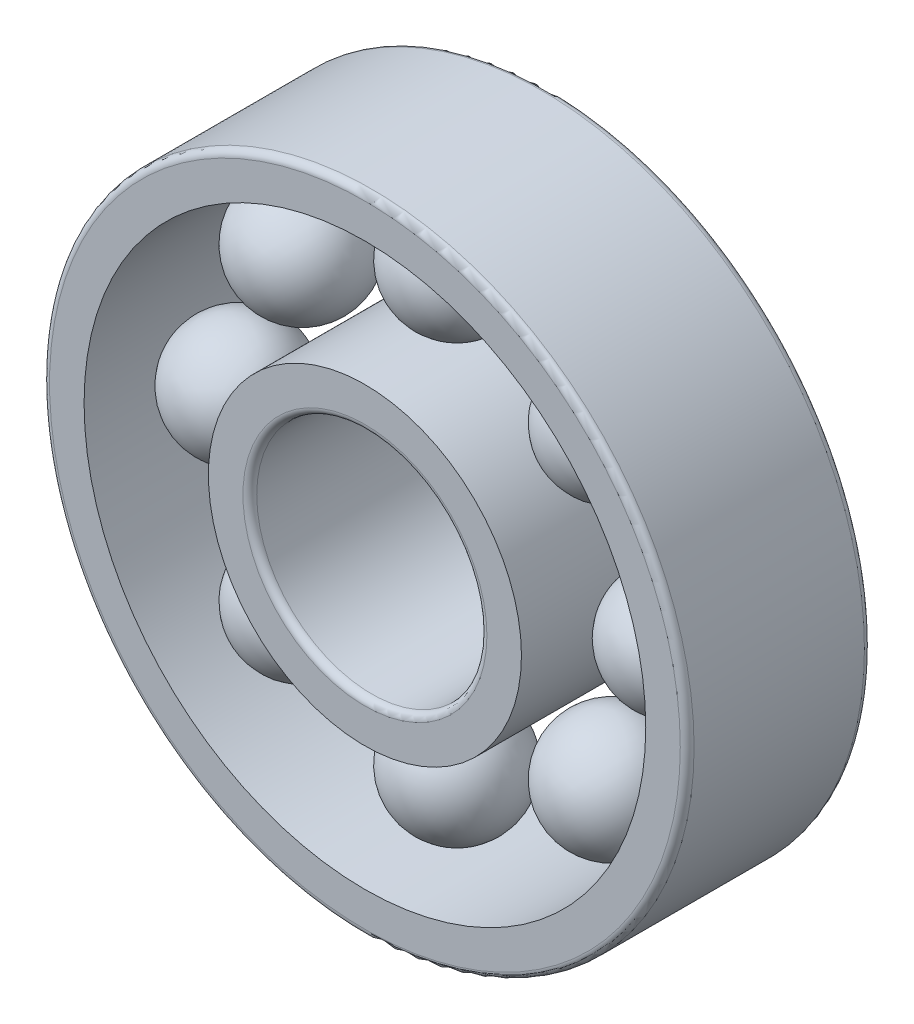
ISO-10303-21;
HEADER;
FILE_DESCRIPTION(('STEP AP214'),'2;1');
FILE_NAME('part.step','',(''),(''),'','','');
FILE_SCHEMA(('AUTOMOTIVE_DESIGN { 1 0 10303 214 1 1 1 1 }'));
ENDSEC;
DATA;
#1=APPLICATION_CONTEXT('core data for automotive mechanical design processes');
#2=APPLICATION_PROTOCOL_DEFINITION('international standard','automotive_design',2000,#1);
#3=PRODUCT_CONTEXT('',#1,'mechanical');
#4=PRODUCT('Part','Part','',(#3));
#5=PRODUCT_RELATED_PRODUCT_CATEGORY('part','',(#4));
#6=PRODUCT_DEFINITION_FORMATION('','',#4);
#7=PRODUCT_DEFINITION_CONTEXT('part definition',#1,'design');
#8=PRODUCT_DEFINITION('design','',#6,#7);
#9=PRODUCT_DEFINITION_SHAPE('','',#8);
#10=(LENGTH_UNIT() NAMED_UNIT(*) SI_UNIT(.MILLI.,.METRE.));
#11=(NAMED_UNIT(*) PLANE_ANGLE_UNIT() SI_UNIT($,.RADIAN.));
#12=(NAMED_UNIT(*) SI_UNIT($,.STERADIAN.) SOLID_ANGLE_UNIT());
#13=UNCERTAINTY_MEASURE_WITH_UNIT(LENGTH_MEASURE(1.E-05),#10,'distance_accuracy_value','');
#14=(GEOMETRIC_REPRESENTATION_CONTEXT(3) GLOBAL_UNCERTAINTY_ASSIGNED_CONTEXT((#13)) GLOBAL_UNIT_ASSIGNED_CONTEXT((#10,
#11,#12)) REPRESENTATION_CONTEXT('',''));
#15=CARTESIAN_POINT('',(0.,0.,0.));
#16=DIRECTION('',(0.,0.,1.));
#17=DIRECTION('',(1.,0.,0.));
#18=AXIS2_PLACEMENT_3D('',#15,#16,#17);
#19=CARTESIAN_POINT('',(6.7175144212722,-6.7175144212722,0.));
#20=DIRECTION('',(-0.707106781186547,0.707106781186548,0.));
#21=DIRECTION('',(0.,0.,-1.));
#22=AXIS2_PLACEMENT_3D('',#19,#20,#21);
#23=SPHERICAL_SURFACE('',#22,2.565);
#24=CARTESIAN_POINT('',(4.90378552752871,-4.90378552752871,0.));
#25=VERTEX_POINT('',#24);
#26=VERTEX_LOOP('',#25);
#27=FACE_BOUND('',#26,.T.);
#28=ADVANCED_FACE('F38',(#27),#23,.T.);
#29=CLOSED_SHELL('',(#28));
#30=MANIFOLD_SOLID_BREP('B2',#29);
#31=CARTESIAN_POINT('',(0.,-9.5,0.));
#32=DIRECTION('',(0.,1.,0.));
#33=DIRECTION('',(0.,0.,-1.));
#34=AXIS2_PLACEMENT_3D('',#31,#32,#33);
#35=SPHERICAL_SURFACE('',#34,2.565);
#36=CARTESIAN_POINT('',(0.,-6.935,0.));
#37=VERTEX_POINT('',#36);
#38=VERTEX_LOOP('',#37);
#39=FACE_BOUND('',#38,.T.);
#40=ADVANCED_FACE('F57',(#39),#35,.T.);
#41=CLOSED_SHELL('',(#40));
#42=MANIFOLD_SOLID_BREP('B6',#41);
#43=CARTESIAN_POINT('',(-6.7175144212722,-6.7175144212722,0.));
#44=DIRECTION('',(0.707106781186548,0.707106781186547,0.));
#45=DIRECTION('',(0.,0.,-1.));
#46=AXIS2_PLACEMENT_3D('',#43,#44,#45);
#47=SPHERICAL_SURFACE('',#46,2.565);
#48=CARTESIAN_POINT('',(-4.90378552752871,-4.90378552752871,0.));
#49=VERTEX_POINT('',#48);
#50=VERTEX_LOOP('',#49);
#51=FACE_BOUND('',#50,.T.);
#52=ADVANCED_FACE('F76',(#51),#47,.T.);
#53=CLOSED_SHELL('',(#52));
#54=MANIFOLD_SOLID_BREP('B34',#53);
#55=CARTESIAN_POINT('',(-9.5,0.,0.));
#56=DIRECTION('',(1.,0.,0.));
#57=DIRECTION('',(0.,0.,-1.));
#58=AXIS2_PLACEMENT_3D('',#55,#56,#57);
#59=SPHERICAL_SURFACE('',#58,2.565);
#60=CARTESIAN_POINT('',(-6.935,0.,0.));
#61=VERTEX_POINT('',#60);
#62=VERTEX_LOOP('',#61);
#63=FACE_BOUND('',#62,.T.);
#64=ADVANCED_FACE('F95',(#63),#59,.T.);
#65=CLOSED_SHELL('',(#64));
#66=MANIFOLD_SOLID_BREP('B53',#65);
#67=CARTESIAN_POINT('',(-6.7175144212722,6.7175144212722,0.));
#68=DIRECTION('',(0.707106781186547,-0.707106781186548,0.));
#69=DIRECTION('',(0.,0.,-1.));
#70=AXIS2_PLACEMENT_3D('',#67,#68,#69);
#71=SPHERICAL_SURFACE('',#70,2.565);
#72=CARTESIAN_POINT('',(-4.90378552752871,4.90378552752871,0.));
#73=VERTEX_POINT('',#72);
#74=VERTEX_LOOP('',#73);
#75=FACE_BOUND('',#74,.T.);
#76=ADVANCED_FACE('F114',(#75),#71,.T.);
#77=CLOSED_SHELL('',(#76));
#78=MANIFOLD_SOLID_BREP('B72',#77);
#79=CARTESIAN_POINT('',(0.,9.5,0.));
#80=DIRECTION('',(0.,-1.,0.));
#81=DIRECTION('',(0.,0.,-1.));
#82=AXIS2_PLACEMENT_3D('',#79,#80,#81);
#83=SPHERICAL_SURFACE('',#82,2.565);
#84=CARTESIAN_POINT('',(0.,6.935,0.));
#85=VERTEX_POINT('',#84);
#86=VERTEX_LOOP('',#85);
#87=FACE_BOUND('',#86,.T.);
#88=ADVANCED_FACE('F133',(#87),#83,.T.);
#89=CLOSED_SHELL('',(#88));
#90=MANIFOLD_SOLID_BREP('B91',#89);
#91=CARTESIAN_POINT('',(6.7175144212722,6.7175144212722,0.));
#92=DIRECTION('',(-0.707106781186548,-0.707106781186548,0.));
#93=DIRECTION('',(0.,0.,-1.));
#94=AXIS2_PLACEMENT_3D('',#91,#92,#93);
#95=SPHERICAL_SURFACE('',#94,2.565);
#96=CARTESIAN_POINT('',(4.90378552752871,4.90378552752871,0.));
#97=VERTEX_POINT('',#96);
#98=VERTEX_LOOP('',#97);
#99=FACE_BOUND('',#98,.T.);
#100=ADVANCED_FACE('F152',(#99),#95,.T.);
#101=CLOSED_SHELL('',(#100));
#102=MANIFOLD_SOLID_BREP('B110',#101);
#103=CARTESIAN_POINT('',(9.5,0.,0.));
#104=DIRECTION('',(-1.,0.,0.));
#105=DIRECTION('',(0.,0.,-1.));
#106=AXIS2_PLACEMENT_3D('',#103,#104,#105);
#107=SPHERICAL_SURFACE('',#106,2.565);
#108=CARTESIAN_POINT('',(6.935,0.,0.));
#109=VERTEX_POINT('',#108);
#110=VERTEX_LOOP('',#109);
#111=FACE_BOUND('',#110,.T.);
#112=ADVANCED_FACE('F173',(#111),#107,.T.);
#113=CLOSED_SHELL('',(#112));
#114=MANIFOLD_SOLID_BREP('B129',#113);
#115=CARTESIAN_POINT('',(0.,0.,7.));
#116=DIRECTION('',(0.,0.,1.));
#117=DIRECTION('',(1.,0.,0.));
#118=AXIS2_PLACEMENT_3D('',#115,#116,#117);
#119=CYLINDRICAL_SURFACE('',#118,12.2);
#120=CARTESIAN_POINT('',(0.,0.,4.));
#121=DIRECTION('',(0.,0.,1.));
#122=DIRECTION('',(1.,0.,0.));
#123=AXIS2_PLACEMENT_3D('',#120,#121,#122);
#124=CIRCLE('',#123,12.2);
#125=CARTESIAN_POINT('',(12.2,0.,4.));
#126=VERTEX_POINT('',#125);
#127=EDGE_CURVE('E213',#126,#126,#124,.T.);
#128=ORIENTED_EDGE('',*,*,#127,.T.);
#129=EDGE_LOOP('',(#128));
#130=FACE_BOUND('',#129,.T.);
#131=CARTESIAN_POINT('',(0.,0.,-4.));
#132=DIRECTION('',(0.,0.,1.));
#133=DIRECTION('',(1.,0.,0.));
#134=AXIS2_PLACEMENT_3D('',#131,#132,#133);
#135=CIRCLE('',#134,12.2);
#136=CARTESIAN_POINT('',(12.2,0.,-4.));
#137=VERTEX_POINT('',#136);
#138=EDGE_CURVE('E216',#137,#137,#135,.T.);
#139=ORIENTED_EDGE('',*,*,#138,.F.);
#140=EDGE_LOOP('',(#139));
#141=FACE_BOUND('',#140,.T.);
#142=ADVANCED_FACE('F193',(#130,#141),#119,.F.);
#143=CARTESIAN_POINT('',(12.2,0.,4.));
#144=DIRECTION('',(0.,0.,1.));
#145=DIRECTION('',(1.,0.,0.));
#146=AXIS2_PLACEMENT_3D('',#143,#144,#145);
#147=PLANE('',#146);
#148=CARTESIAN_POINT('',(0.,0.,4.));
#149=DIRECTION('',(0.,0.,1.));
#150=DIRECTION('',(1.,0.,0.));
#151=AXIS2_PLACEMENT_3D('',#148,#149,#150);
#152=CIRCLE('',#151,13.7);
#153=CARTESIAN_POINT('',(13.7,0.,4.));
#154=VERTEX_POINT('',#153);
#155=EDGE_CURVE('E172',#154,#154,#152,.T.);
#156=ORIENTED_EDGE('',*,*,#155,.T.);
#157=EDGE_LOOP('',(#156));
#158=FACE_BOUND('',#157,.T.);
#159=ORIENTED_EDGE('',*,*,#127,.F.);
#160=EDGE_LOOP('',(#159));
#161=FACE_BOUND('',#160,.T.);
#162=ADVANCED_FACE('F223',(#158,#161),#147,.T.);
#163=CARTESIAN_POINT('',(0.,0.,7.));
#164=DIRECTION('',(0.,0.,1.));
#165=DIRECTION('',(1.,0.,0.));
#166=AXIS2_PLACEMENT_3D('',#163,#164,#165);
#167=CYLINDRICAL_SURFACE('',#166,14.);
#168=CARTESIAN_POINT('',(0.,0.,-3.7));
#169=DIRECTION('',(0.,0.,-1.));
#170=DIRECTION('',(-1.,0.,0.));
#171=AXIS2_PLACEMENT_3D('',#168,#169,#170);
#172=CIRCLE('',#171,14.);
#173=CARTESIAN_POINT('',(-14.,0.,-3.7));
#174=VERTEX_POINT('',#173);
#175=EDGE_CURVE('E204',#174,#174,#172,.F.);
#176=ORIENTED_EDGE('',*,*,#175,.T.);
#177=EDGE_LOOP('',(#176));
#178=FACE_BOUND('',#177,.T.);
#179=CARTESIAN_POINT('',(0.,0.,3.7));
#180=DIRECTION('',(0.,0.,1.));
#181=DIRECTION('',(1.,0.,0.));
#182=AXIS2_PLACEMENT_3D('',#179,#180,#181);
#183=CIRCLE('',#182,14.);
#184=CARTESIAN_POINT('',(14.,0.,3.7));
#185=VERTEX_POINT('',#184);
#186=EDGE_CURVE('E208',#185,#185,#183,.F.);
#187=ORIENTED_EDGE('',*,*,#186,.T.);
#188=EDGE_LOOP('',(#187));
#189=FACE_BOUND('',#188,.T.);
#190=ADVANCED_FACE('F229',(#178,#189),#167,.T.);
#191=CARTESIAN_POINT('',(14.,0.,-4.));
#192=DIRECTION('',(0.,0.,-1.));
#193=DIRECTION('',(-1.,0.,0.));
#194=AXIS2_PLACEMENT_3D('',#191,#192,#193);
#195=PLANE('',#194);
#196=CARTESIAN_POINT('',(0.,0.,-4.));
#197=DIRECTION('',(0.,0.,-1.));
#198=DIRECTION('',(-1.,0.,0.));
#199=AXIS2_PLACEMENT_3D('',#196,#197,#198);
#200=CIRCLE('',#199,13.7);
#201=CARTESIAN_POINT('',(-13.7,0.,-4.));
#202=VERTEX_POINT('',#201);
#203=EDGE_CURVE('E200',#202,#202,#200,.T.);
#204=ORIENTED_EDGE('',*,*,#203,.T.);
#205=EDGE_LOOP('',(#204));
#206=FACE_BOUND('',#205,.T.);
#207=ORIENTED_EDGE('',*,*,#138,.T.);
#208=EDGE_LOOP('',(#207));
#209=FACE_BOUND('',#208,.T.);
#210=ADVANCED_FACE('F220',(#206,#209),#195,.T.);
#211=CARTESIAN_POINT('',(0.,0.,-3.7));
#212=DIRECTION('',(0.,0.,-1.));
#213=DIRECTION('',(-1.,0.,0.));
#214=AXIS2_PLACEMENT_3D('',#211,#212,#213);
#215=TOROIDAL_SURFACE('',#214,13.7,0.3);
#216=ORIENTED_EDGE('',*,*,#203,.F.);
#217=EDGE_LOOP('',(#216));
#218=FACE_BOUND('',#217,.T.);
#219=ORIENTED_EDGE('',*,*,#175,.F.);
#220=EDGE_LOOP('',(#219));
#221=FACE_BOUND('',#220,.T.);
#222=ADVANCED_FACE('F232',(#218,#221),#215,.T.);
#223=CARTESIAN_POINT('',(0.,0.,3.7));
#224=DIRECTION('',(0.,0.,1.));
#225=DIRECTION('',(1.,0.,0.));
#226=AXIS2_PLACEMENT_3D('',#223,#224,#225);
#227=TOROIDAL_SURFACE('',#226,13.7,0.3);
#228=ORIENTED_EDGE('',*,*,#186,.F.);
#229=EDGE_LOOP('',(#228));
#230=FACE_BOUND('',#229,.T.);
#231=ORIENTED_EDGE('',*,*,#155,.F.);
#232=EDGE_LOOP('',(#231));
#233=FACE_BOUND('',#232,.T.);
#234=ADVANCED_FACE('F195',(#230,#233),#227,.T.);
#235=CLOSED_SHELL('',(#142,#162,#190,#210,#222,#234));
#236=MANIFOLD_SOLID_BREP('B148',#235);
#237=CARTESIAN_POINT('',(0.,0.,7.));
#238=DIRECTION('',(0.,0.,1.));
#239=DIRECTION('',(1.,0.,0.));
#240=AXIS2_PLACEMENT_3D('',#237,#238,#239);
#241=CYLINDRICAL_SURFACE('',#240,5.);
#242=CARTESIAN_POINT('',(0.,0.,-3.7));
#243=DIRECTION('',(0.,0.,-1.));
#244=DIRECTION('',(-1.,0.,0.));
#245=AXIS2_PLACEMENT_3D('',#242,#243,#244);
#246=CIRCLE('',#245,5.);
#247=CARTESIAN_POINT('',(-5.,0.,-3.7));
#248=VERTEX_POINT('',#247);
#249=EDGE_CURVE('E292',#248,#248,#246,.T.);
#250=ORIENTED_EDGE('',*,*,#249,.T.);
#251=EDGE_LOOP('',(#250));
#252=FACE_BOUND('',#251,.T.);
#253=CARTESIAN_POINT('',(0.,0.,3.7));
#254=DIRECTION('',(0.,0.,1.));
#255=DIRECTION('',(1.,0.,0.));
#256=AXIS2_PLACEMENT_3D('',#253,#254,#255);
#257=CIRCLE('',#256,5.);
#258=CARTESIAN_POINT('',(5.,0.,3.7));
#259=VERTEX_POINT('',#258);
#260=EDGE_CURVE('E296',#259,#259,#257,.T.);
#261=ORIENTED_EDGE('',*,*,#260,.T.);
#262=EDGE_LOOP('',(#261));
#263=FACE_BOUND('',#262,.T.);
#264=ADVANCED_FACE('F285',(#252,#263),#241,.F.);
#265=CARTESIAN_POINT('',(5.,0.,4.));
#266=DIRECTION('',(0.,0.,1.));
#267=DIRECTION('',(1.,0.,0.));
#268=AXIS2_PLACEMENT_3D('',#265,#266,#267);
#269=PLANE('',#268);
#270=CARTESIAN_POINT('',(0.,0.,4.));
#271=DIRECTION('',(0.,0.,1.));
#272=DIRECTION('',(1.,0.,0.));
#273=AXIS2_PLACEMENT_3D('',#270,#271,#272);
#274=CIRCLE('',#273,5.3);
#275=CARTESIAN_POINT('',(5.3,0.,4.));
#276=VERTEX_POINT('',#275);
#277=EDGE_CURVE('E192',#276,#276,#274,.F.);
#278=ORIENTED_EDGE('',*,*,#277,.T.);
#279=EDGE_LOOP('',(#278));
#280=FACE_BOUND('',#279,.T.);
#281=CARTESIAN_POINT('',(0.,0.,4.));
#282=DIRECTION('',(0.,0.,1.));
#283=DIRECTION('',(1.,0.,0.));
#284=AXIS2_PLACEMENT_3D('',#281,#282,#283);
#285=CIRCLE('',#284,6.8);
#286=CARTESIAN_POINT('',(6.8,0.,4.));
#287=VERTEX_POINT('',#286);
#288=EDGE_CURVE('E305',#287,#287,#285,.T.);
#289=ORIENTED_EDGE('',*,*,#288,.T.);
#290=EDGE_LOOP('',(#289));
#291=FACE_BOUND('',#290,.T.);
#292=ADVANCED_FACE('F325',(#280,#291),#269,.T.);
#293=CARTESIAN_POINT('',(0.,0.,7.));
#294=DIRECTION('',(0.,0.,1.));
#295=DIRECTION('',(1.,0.,0.));
#296=AXIS2_PLACEMENT_3D('',#293,#294,#295);
#297=CYLINDRICAL_SURFACE('',#296,6.8);
#298=CARTESIAN_POINT('',(0.,0.,-4.));
#299=DIRECTION('',(0.,0.,1.));
#300=DIRECTION('',(1.,0.,0.));
#301=AXIS2_PLACEMENT_3D('',#298,#299,#300);
#302=CIRCLE('',#301,6.8);
#303=CARTESIAN_POINT('',(6.8,0.,-4.));
#304=VERTEX_POINT('',#303);
#305=EDGE_CURVE('E308',#304,#304,#302,.T.);
#306=ORIENTED_EDGE('',*,*,#305,.T.);
#307=EDGE_LOOP('',(#306));
#308=FACE_BOUND('',#307,.T.);
#309=ORIENTED_EDGE('',*,*,#288,.F.);
#310=EDGE_LOOP('',(#309));
#311=FACE_BOUND('',#310,.T.);
#312=ADVANCED_FACE('F312',(#308,#311),#297,.T.);
#313=CARTESIAN_POINT('',(6.8,0.,-4.));
#314=DIRECTION('',(0.,0.,-1.));
#315=DIRECTION('',(-1.,0.,0.));
#316=AXIS2_PLACEMENT_3D('',#313,#314,#315);
#317=PLANE('',#316);
#318=CARTESIAN_POINT('',(0.,0.,-4.));
#319=DIRECTION('',(0.,0.,-1.));
#320=DIRECTION('',(-1.,0.,0.));
#321=AXIS2_PLACEMENT_3D('',#318,#319,#320);
#322=CIRCLE('',#321,5.3);
#323=CARTESIAN_POINT('',(-5.3,0.,-4.));
#324=VERTEX_POINT('',#323);
#325=EDGE_CURVE('E300',#324,#324,#322,.F.);
#326=ORIENTED_EDGE('',*,*,#325,.T.);
#327=EDGE_LOOP('',(#326));
#328=FACE_BOUND('',#327,.T.);
#329=ORIENTED_EDGE('',*,*,#305,.F.);
#330=EDGE_LOOP('',(#329));
#331=FACE_BOUND('',#330,.T.);
#332=ADVANCED_FACE('F315',(#328,#331),#317,.T.);
#333=CARTESIAN_POINT('',(0.,0.,-3.7));
#334=DIRECTION('',(0.,0.,-1.));
#335=DIRECTION('',(-1.,0.,0.));
#336=AXIS2_PLACEMENT_3D('',#333,#334,#335);
#337=TOROIDAL_SURFACE('',#336,5.3,0.3);
#338=ORIENTED_EDGE('',*,*,#249,.F.);
#339=EDGE_LOOP('',(#338));
#340=FACE_BOUND('',#339,.T.);
#341=ORIENTED_EDGE('',*,*,#325,.F.);
#342=EDGE_LOOP('',(#341));
#343=FACE_BOUND('',#342,.T.);
#344=ADVANCED_FACE('F317',(#340,#343),#337,.T.);
#345=CARTESIAN_POINT('',(0.,0.,3.7));
#346=DIRECTION('',(0.,0.,1.));
#347=DIRECTION('',(1.,0.,0.));
#348=AXIS2_PLACEMENT_3D('',#345,#346,#347);
#349=TOROIDAL_SURFACE('',#348,5.3,0.3);
#350=ORIENTED_EDGE('',*,*,#277,.F.);
#351=EDGE_LOOP('',(#350));
#352=FACE_BOUND('',#351,.T.);
#353=ORIENTED_EDGE('',*,*,#260,.F.);
#354=EDGE_LOOP('',(#353));
#355=FACE_BOUND('',#354,.T.);
#356=ADVANCED_FACE('F287',(#352,#355),#349,.T.);
#357=CLOSED_SHELL('',(#264,#292,#312,#332,#344,#356));
#358=MANIFOLD_SOLID_BREP('B167',#357);
#359=ADVANCED_BREP_SHAPE_REPRESENTATION('',(#18,#30,#42,#54,#66,#78,#90,#102,#114,#236,#358),#14);
#360=SHAPE_DEFINITION_REPRESENTATION(#9,#359);
ENDSEC;
END-ISO-10303-21;
